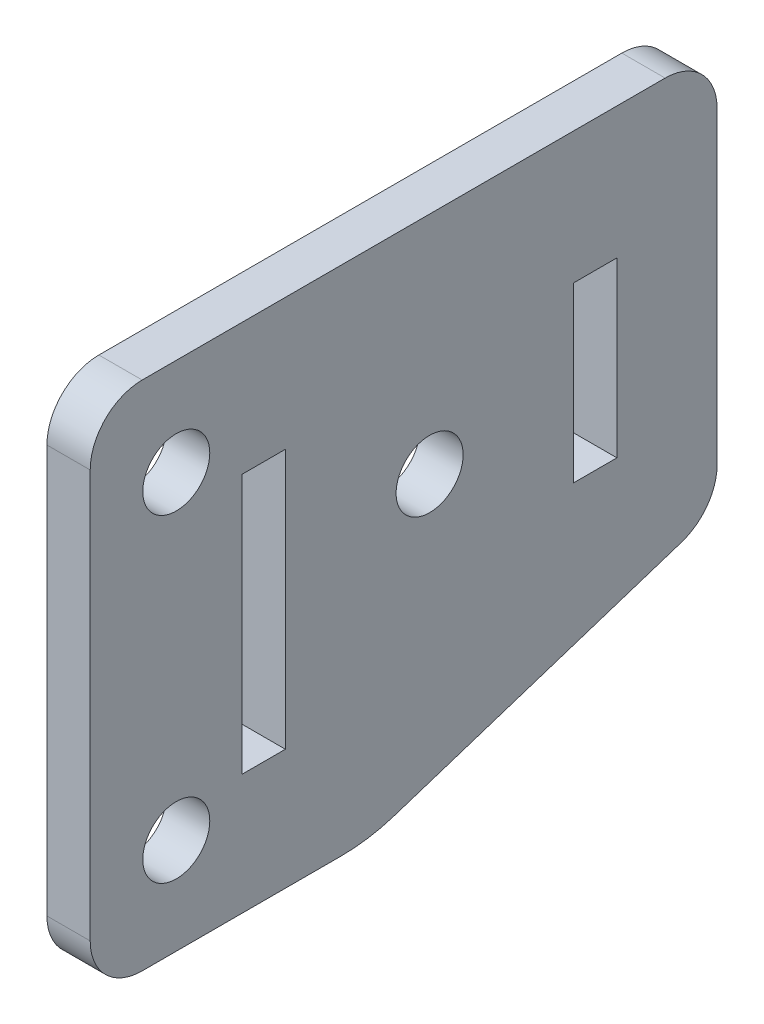
ISO-10303-21;
HEADER;
FILE_DESCRIPTION(('STEP AP214'),'2;1');
FILE_NAME('part.step','',(''),(''),'','','');
FILE_SCHEMA(('AUTOMOTIVE_DESIGN { 1 0 10303 214 1 1 1 1 }'));
ENDSEC;
DATA;
#1=APPLICATION_CONTEXT('core data for automotive mechanical design processes');
#2=APPLICATION_PROTOCOL_DEFINITION('international standard','automotive_design',2000,#1);
#3=PRODUCT_CONTEXT('',#1,'mechanical');
#4=PRODUCT('Part','Part','',(#3));
#5=PRODUCT_RELATED_PRODUCT_CATEGORY('part','',(#4));
#6=PRODUCT_DEFINITION_FORMATION('','',#4);
#7=PRODUCT_DEFINITION_CONTEXT('part definition',#1,'design');
#8=PRODUCT_DEFINITION('design','',#6,#7);
#9=PRODUCT_DEFINITION_SHAPE('','',#8);
#10=(LENGTH_UNIT() NAMED_UNIT(*) SI_UNIT(.MILLI.,.METRE.));
#11=(NAMED_UNIT(*) PLANE_ANGLE_UNIT() SI_UNIT($,.RADIAN.));
#12=(NAMED_UNIT(*) SI_UNIT($,.STERADIAN.) SOLID_ANGLE_UNIT());
#13=UNCERTAINTY_MEASURE_WITH_UNIT(LENGTH_MEASURE(1.E-05),#10,'distance_accuracy_value','');
#14=(GEOMETRIC_REPRESENTATION_CONTEXT(3) GLOBAL_UNCERTAINTY_ASSIGNED_CONTEXT((#13)) GLOBAL_UNIT_ASSIGNED_CONTEXT((#10,
#11,#12)) REPRESENTATION_CONTEXT('',''));
#15=CARTESIAN_POINT('',(0.,0.,0.));
#16=DIRECTION('',(0.,0.,1.));
#17=DIRECTION('',(1.,0.,0.));
#18=AXIS2_PLACEMENT_3D('',#15,#16,#17);
#19=CARTESIAN_POINT('',(-3.175,25.4,57.404));
#20=DIRECTION('',(0.,0.,1.));
#21=DIRECTION('',(0.,-1.,0.));
#22=AXIS2_PLACEMENT_3D('',#19,#20,#21);
#23=PLANE('',#22);
#24=DIRECTION('',(0.,-1.,0.));
#25=VECTOR('',#24,1.);
#26=CARTESIAN_POINT('',(0.,25.4,57.404));
#27=LINE('',#26,#25);
#28=CARTESIAN_POINT('',(0.,21.59,57.404));
#29=VERTEX_POINT('',#28);
#30=CARTESIAN_POINT('',(0.,-8.32104000000001,57.404));
#31=VERTEX_POINT('',#30);
#32=EDGE_CURVE('E258',#29,#31,#27,.T.);
#33=ORIENTED_EDGE('',*,*,#32,.F.);
#34=DIRECTION('',(1.,0.,0.));
#35=VECTOR('',#34,1.);
#36=CARTESIAN_POINT('',(-3.175,21.59,57.404));
#37=LINE('',#36,#35);
#38=CARTESIAN_POINT('',(-3.175,21.59,57.404));
#39=VERTEX_POINT('',#38);
#40=EDGE_CURVE('E42',#29,#39,#37,.F.);
#41=ORIENTED_EDGE('',*,*,#40,.T.);
#42=DIRECTION('',(0.,-1.,0.));
#43=VECTOR('',#42,1.);
#44=CARTESIAN_POINT('',(-3.175,25.4,57.404));
#45=LINE('',#44,#43);
#46=CARTESIAN_POINT('',(-3.175,-8.32104000000001,57.404));
#47=VERTEX_POINT('',#46);
#48=EDGE_CURVE('E269',#39,#47,#45,.T.);
#49=ORIENTED_EDGE('',*,*,#48,.T.);
#50=DIRECTION('',(1.,0.,0.));
#51=VECTOR('',#50,1.);
#52=CARTESIAN_POINT('',(-3.175,-8.32104000000001,57.404));
#53=LINE('',#52,#51);
#54=EDGE_CURVE('E318',#47,#31,#53,.T.);
#55=ORIENTED_EDGE('',*,*,#54,.T.);
#56=EDGE_LOOP('',(#33,#41,#49,#55));
#57=FACE_BOUND('',#56,.T.);
#58=ADVANCED_FACE('F34',(#57),#23,.T.);
#59=CARTESIAN_POINT('',(-3.175,25.4,11.43));
#60=DIRECTION('',(0.,1.,0.));
#61=DIRECTION('',(0.,0.,1.));
#62=AXIS2_PLACEMENT_3D('',#59,#60,#61);
#63=PLANE('',#62);
#64=DIRECTION('',(0.,0.,1.));
#65=VECTOR('',#64,1.);
#66=CARTESIAN_POINT('',(0.,25.4,11.43));
#67=LINE('',#66,#65);
#68=CARTESIAN_POINT('',(0.,25.4,15.24));
#69=VERTEX_POINT('',#68);
#70=CARTESIAN_POINT('',(0.,25.4,53.594));
#71=VERTEX_POINT('',#70);
#72=EDGE_CURVE('E282',#69,#71,#67,.T.);
#73=ORIENTED_EDGE('',*,*,#72,.F.);
#74=DIRECTION('',(1.,0.,0.));
#75=VECTOR('',#74,1.);
#76=CARTESIAN_POINT('',(-3.175,25.4,15.24));
#77=LINE('',#76,#75);
#78=CARTESIAN_POINT('',(-3.175,25.4,15.24));
#79=VERTEX_POINT('',#78);
#80=EDGE_CURVE('E307',#69,#79,#77,.F.);
#81=ORIENTED_EDGE('',*,*,#80,.T.);
#82=DIRECTION('',(0.,0.,1.));
#83=VECTOR('',#82,1.);
#84=CARTESIAN_POINT('',(-3.175,25.4,11.43));
#85=LINE('',#84,#83);
#86=CARTESIAN_POINT('',(-3.175,25.4,53.594));
#87=VERTEX_POINT('',#86);
#88=EDGE_CURVE('E266',#79,#87,#85,.T.);
#89=ORIENTED_EDGE('',*,*,#88,.T.);
#90=DIRECTION('',(1.,0.,0.));
#91=VECTOR('',#90,1.);
#92=CARTESIAN_POINT('',(-3.175,25.4,53.594));
#93=LINE('',#92,#91);
#94=EDGE_CURVE('E304',#87,#71,#93,.T.);
#95=ORIENTED_EDGE('',*,*,#94,.T.);
#96=EDGE_LOOP('',(#73,#81,#89,#95));
#97=FACE_BOUND('',#96,.T.);
#98=ADVANCED_FACE('F332',(#97),#63,.T.);
#99=CARTESIAN_POINT('',(-3.175,-3.83383616291751,11.43));
#100=DIRECTION('',(0.,0.,-1.));
#101=DIRECTION('',(-1.,0.,0.));
#102=AXIS2_PLACEMENT_3D('',#99,#100,#101);
#103=PLANE('',#102);
#104=DIRECTION('',(0.,1.,0.));
#105=VECTOR('',#104,1.);
#106=CARTESIAN_POINT('',(-3.175,-3.83383616291751,11.43));
#107=LINE('',#106,#105);
#108=CARTESIAN_POINT('',(-3.175,-1.06497014433907,11.43));
#109=VERTEX_POINT('',#108);
#110=CARTESIAN_POINT('',(-3.175,21.59,11.43));
#111=VERTEX_POINT('',#110);
#112=EDGE_CURVE('E263',#109,#111,#107,.T.);
#113=ORIENTED_EDGE('',*,*,#112,.T.);
#114=DIRECTION('',(1.,0.,0.));
#115=VECTOR('',#114,1.);
#116=CARTESIAN_POINT('',(-3.175,21.59,11.43));
#117=LINE('',#116,#115);
#118=CARTESIAN_POINT('',(0.,21.59,11.43));
#119=VERTEX_POINT('',#118);
#120=EDGE_CURVE('E293',#111,#119,#117,.T.);
#121=ORIENTED_EDGE('',*,*,#120,.T.);
#122=DIRECTION('',(0.,1.,0.));
#123=VECTOR('',#122,1.);
#124=CARTESIAN_POINT('',(0.,-3.83383616291751,11.43));
#125=LINE('',#124,#123);
#126=CARTESIAN_POINT('',(0.,-1.06497014433907,11.43));
#127=VERTEX_POINT('',#126);
#128=EDGE_CURVE('E279',#127,#119,#125,.T.);
#129=ORIENTED_EDGE('',*,*,#128,.F.);
#130=DIRECTION('',(1.,0.,0.));
#131=VECTOR('',#130,1.);
#132=CARTESIAN_POINT('',(-3.175,-1.06497014433907,11.43));
#133=LINE('',#132,#131);
#134=EDGE_CURVE('E289',#127,#109,#133,.F.);
#135=ORIENTED_EDGE('',*,*,#134,.T.);
#136=EDGE_LOOP('',(#113,#121,#129,#135));
#137=FACE_BOUND('',#136,.T.);
#138=ADVANCED_FACE('F341',(#137),#103,.T.);
#139=CARTESIAN_POINT('',(-3.175,-11.5104536973722,35.0766243864602));
#140=DIRECTION('',(0.,-0.95113493680096,-0.308775536590309));
#141=DIRECTION('',(0.,0.308775536590309,-0.951134936800961));
#142=AXIS2_PLACEMENT_3D('',#139,#140,#141);
#143=PLANE('',#142);
#144=DIRECTION('',(0.,0.308775536590309,-0.95113493680096));
#145=VECTOR('',#144,1.);
#146=CARTESIAN_POINT('',(-3.175,-11.5104536973722,35.0766243864602));
#147=LINE('',#146,#145);
#148=CARTESIAN_POINT('',(-3.175,-11.5104536973722,35.0766243864602));
#149=VERTEX_POINT('',#148);
#150=CARTESIAN_POINT('',(-3.175,-4.68879425355073,14.0635652055909));
#151=VERTEX_POINT('',#150);
#152=EDGE_CURVE('E261',#149,#151,#147,.T.);
#153=ORIENTED_EDGE('',*,*,#152,.T.);
#154=DIRECTION('',(1.,0.,0.));
#155=VECTOR('',#154,1.);
#156=CARTESIAN_POINT('',(-3.175,-4.68879425355073,14.0635652055909));
#157=LINE('',#156,#155);
#158=CARTESIAN_POINT('',(0.,-4.68879425355073,14.0635652055909));
#159=VERTEX_POINT('',#158);
#160=EDGE_CURVE('E315',#151,#159,#157,.T.);
#161=ORIENTED_EDGE('',*,*,#160,.T.);
#162=DIRECTION('',(0.,0.308775536590309,-0.95113493680096));
#163=VECTOR('',#162,1.);
#164=CARTESIAN_POINT('',(0.,-11.5104536973722,35.0766243864602));
#165=LINE('',#164,#163);
#166=CARTESIAN_POINT('',(0.,-11.5104536973722,35.0766243864602));
#167=VERTEX_POINT('',#166);
#168=EDGE_CURVE('E276',#167,#159,#165,.T.);
#169=ORIENTED_EDGE('',*,*,#168,.F.);
#170=DIRECTION('',(1.,0.,0.));
#171=VECTOR('',#170,1.);
#172=CARTESIAN_POINT('',(-3.175,-11.5104536973722,35.0766243864602));
#173=LINE('',#172,#171);
#174=EDGE_CURVE('E287',#149,#167,#173,.T.);
#175=ORIENTED_EDGE('',*,*,#174,.F.);
#176=EDGE_LOOP('',(#153,#161,#169,#175));
#177=FACE_BOUND('',#176,.T.);
#178=ADVANCED_FACE('F348',(#177),#143,.T.);
#179=CARTESIAN_POINT('',(-3.175,0.56895999999998,38.9980737011571));
#180=DIRECTION('',(1.,0.,0.));
#181=DIRECTION('',(0.,0.,-1.));
#182=AXIS2_PLACEMENT_3D('',#179,#180,#181);
#183=CYLINDRICAL_SURFACE('',#182,12.7);
#184=CARTESIAN_POINT('',(0.,0.56895999999998,38.9980737011571));
#185=DIRECTION('',(1.,0.,0.));
#186=DIRECTION('',(0.,0.,-1.));
#187=AXIS2_PLACEMENT_3D('',#184,#185,#186);
#188=CIRCLE('',#187,12.7);
#189=CARTESIAN_POINT('',(0.,-12.13104,38.9980737011571));
#190=VERTEX_POINT('',#189);
#191=EDGE_CURVE('E273',#190,#167,#188,.T.);
#192=ORIENTED_EDGE('',*,*,#191,.F.);
#193=DIRECTION('',(1.,0.,0.));
#194=VECTOR('',#193,1.);
#195=CARTESIAN_POINT('',(-3.175,-12.13104,38.9980737011571));
#196=LINE('',#195,#194);
#197=CARTESIAN_POINT('',(-3.175,-12.13104,38.9980737011571));
#198=VERTEX_POINT('',#197);
#199=EDGE_CURVE('E271',#198,#190,#196,.T.);
#200=ORIENTED_EDGE('',*,*,#199,.F.);
#201=CARTESIAN_POINT('',(-3.175,0.56895999999998,38.9980737011571));
#202=DIRECTION('',(1.,0.,0.));
#203=DIRECTION('',(0.,0.,-1.));
#204=AXIS2_PLACEMENT_3D('',#201,#202,#203);
#205=CIRCLE('',#204,12.7);
#206=EDGE_CURVE('E257',#198,#149,#205,.T.);
#207=ORIENTED_EDGE('',*,*,#206,.T.);
#208=ORIENTED_EDGE('',*,*,#174,.T.);
#209=EDGE_LOOP('',(#192,#200,#207,#208));
#210=FACE_BOUND('',#209,.T.);
#211=ADVANCED_FACE('F353',(#210),#183,.T.);
#212=CARTESIAN_POINT('',(-3.175,-12.13104,38.9980737011571));
#213=DIRECTION('',(0.,-1.,0.));
#214=DIRECTION('',(0.,0.,-1.));
#215=AXIS2_PLACEMENT_3D('',#212,#213,#214);
#216=PLANE('',#215);
#217=DIRECTION('',(0.,0.,-1.));
#218=VECTOR('',#217,1.);
#219=CARTESIAN_POINT('',(0.,-12.13104,38.9980737011571));
#220=LINE('',#219,#218);
#221=CARTESIAN_POINT('',(0.,-12.13104,53.594));
#222=VERTEX_POINT('',#221);
#223=EDGE_CURVE('E254',#222,#190,#220,.T.);
#224=ORIENTED_EDGE('',*,*,#223,.F.);
#225=DIRECTION('',(1.,0.,0.));
#226=VECTOR('',#225,1.);
#227=CARTESIAN_POINT('',(-3.175,-12.13104,53.594));
#228=LINE('',#227,#226);
#229=CARTESIAN_POINT('',(-3.175,-12.13104,53.594));
#230=VERTEX_POINT('',#229);
#231=EDGE_CURVE('E11',#222,#230,#228,.F.);
#232=ORIENTED_EDGE('',*,*,#231,.T.);
#233=DIRECTION('',(0.,0.,-1.));
#234=VECTOR('',#233,1.);
#235=CARTESIAN_POINT('',(-3.175,-12.13104,39.2034693834696));
#236=LINE('',#235,#234);
#237=EDGE_CURVE('E255',#230,#198,#236,.T.);
#238=ORIENTED_EDGE('',*,*,#237,.T.);
#239=ORIENTED_EDGE('',*,*,#199,.T.);
#240=EDGE_LOOP('',(#224,#232,#238,#239));
#241=FACE_BOUND('',#240,.T.);
#242=ADVANCED_FACE('F358',(#241),#216,.T.);
#243=CARTESIAN_POINT('',(-3.175,0.56895999999998,38.9980737011571));
#244=DIRECTION('',(1.,0.,0.));
#245=DIRECTION('',(0.,0.,-1.));
#246=AXIS2_PLACEMENT_3D('',#243,#244,#245);
#247=PLANE('',#246);
#248=DIRECTION('',(0.,-1.,0.));
#249=VECTOR('',#248,1.);
#250=CARTESIAN_POINT('',(-3.175,-3.30200000000007,43.0911));
#251=LINE('',#250,#249);
#252=CARTESIAN_POINT('',(-3.175,15.7479999999999,43.0911));
#253=VERTEX_POINT('',#252);
#254=CARTESIAN_POINT('',(-3.175,-3.30200000000007,43.0911));
#255=VERTEX_POINT('',#254);
#256=EDGE_CURVE('E195',#253,#255,#251,.T.);
#257=ORIENTED_EDGE('',*,*,#256,.F.);
#258=DIRECTION('',(0.,0.,-1.));
#259=VECTOR('',#258,1.);
#260=CARTESIAN_POINT('',(-3.175,15.7479999999999,43.0911));
#261=LINE('',#260,#259);
#262=CARTESIAN_POINT('',(-3.175,15.7479999999999,46.2661));
#263=VERTEX_POINT('',#262);
#264=EDGE_CURVE('E168',#263,#253,#261,.T.);
#265=ORIENTED_EDGE('',*,*,#264,.F.);
#266=DIRECTION('',(0.,1.,0.));
#267=VECTOR('',#266,1.);
#268=CARTESIAN_POINT('',(-3.175,15.7479999999999,46.2661));
#269=LINE('',#268,#267);
#270=CARTESIAN_POINT('',(-3.175,-3.30200000000007,46.2661));
#271=VERTEX_POINT('',#270);
#272=EDGE_CURVE('E186',#271,#263,#269,.T.);
#273=ORIENTED_EDGE('',*,*,#272,.F.);
#274=DIRECTION('',(0.,0.,1.));
#275=VECTOR('',#274,1.);
#276=CARTESIAN_POINT('',(-3.175,-3.30200000000007,46.2661));
#277=LINE('',#276,#275);
#278=EDGE_CURVE('E189',#255,#271,#277,.T.);
#279=ORIENTED_EDGE('',*,*,#278,.F.);
#280=EDGE_LOOP('',(#257,#265,#273,#279));
#281=FACE_BOUND('',#280,.T.);
#282=DIRECTION('',(0.,0.,-1.));
#283=VECTOR('',#282,1.);
#284=CARTESIAN_POINT('',(-3.175,15.7479999999999,21.9521444970417));
#285=LINE('',#284,#283);
#286=CARTESIAN_POINT('',(-3.175,15.7479999999999,21.9521444970417));
#287=VERTEX_POINT('',#286);
#288=CARTESIAN_POINT('',(-3.175,15.7479999999999,18.7771444970417));
#289=VERTEX_POINT('',#288);
#290=EDGE_CURVE('E222',#287,#289,#285,.T.);
#291=ORIENTED_EDGE('',*,*,#290,.F.);
#292=DIRECTION('',(0.,1.,0.));
#293=VECTOR('',#292,1.);
#294=CARTESIAN_POINT('',(-3.175,3.04799999999992,21.9521444970417));
#295=LINE('',#294,#293);
#296=CARTESIAN_POINT('',(-3.175,3.04799999999992,21.9521444970417));
#297=VERTEX_POINT('',#296);
#298=EDGE_CURVE('E220',#297,#287,#295,.T.);
#299=ORIENTED_EDGE('',*,*,#298,.F.);
#300=DIRECTION('',(0.,0.,1.));
#301=VECTOR('',#300,1.);
#302=CARTESIAN_POINT('',(-3.175,3.04799999999992,18.7771444970417));
#303=LINE('',#302,#301);
#304=CARTESIAN_POINT('',(-3.175,3.04799999999992,18.7771444970417));
#305=VERTEX_POINT('',#304);
#306=EDGE_CURVE('E210',#305,#297,#303,.T.);
#307=ORIENTED_EDGE('',*,*,#306,.F.);
#308=DIRECTION('',(0.,-1.,0.));
#309=VECTOR('',#308,1.);
#310=CARTESIAN_POINT('',(-3.175,15.7479999999999,18.7771444970417));
#311=LINE('',#310,#309);
#312=EDGE_CURVE('E225',#289,#305,#311,.T.);
#313=ORIENTED_EDGE('',*,*,#312,.F.);
#314=EDGE_LOOP('',(#291,#299,#307,#313));
#315=FACE_BOUND('',#314,.T.);
#316=CARTESIAN_POINT('',(-3.175,-5.08000000000002,51.0921));
#317=DIRECTION('',(1.,0.,0.));
#318=DIRECTION('',(0.,0.,-1.));
#319=AXIS2_PLACEMENT_3D('',#316,#317,#318);
#320=CIRCLE('',#319,2.45744999999999);
#321=CARTESIAN_POINT('',(-3.175,-5.08000000000002,48.63465));
#322=VERTEX_POINT('',#321);
#323=EDGE_CURVE('E239',#322,#322,#320,.T.);
#324=ORIENTED_EDGE('',*,*,#323,.T.);
#325=EDGE_LOOP('',(#324));
#326=FACE_BOUND('',#325,.T.);
#327=CARTESIAN_POINT('',(-3.175,18.288,51.0921));
#328=DIRECTION('',(1.,0.,0.));
#329=DIRECTION('',(0.,0.,-1.));
#330=AXIS2_PLACEMENT_3D('',#327,#328,#329);
#331=CIRCLE('',#330,2.45744999999999);
#332=CARTESIAN_POINT('',(-3.175,18.288,48.63465));
#333=VERTEX_POINT('',#332);
#334=EDGE_CURVE('E245',#333,#333,#331,.T.);
#335=ORIENTED_EDGE('',*,*,#334,.T.);
#336=EDGE_LOOP('',(#335));
#337=FACE_BOUND('',#336,.T.);
#338=CARTESIAN_POINT('',(-3.175,8.89,32.5120000000061));
#339=DIRECTION('',(1.,0.,0.));
#340=DIRECTION('',(0.,0.,-1.));
#341=AXIS2_PLACEMENT_3D('',#338,#339,#340);
#342=CIRCLE('',#341,2.45744999999999);
#343=CARTESIAN_POINT('',(-3.175,8.89,30.0545500000061));
#344=VERTEX_POINT('',#343);
#345=EDGE_CURVE('E251',#344,#344,#342,.T.);
#346=ORIENTED_EDGE('',*,*,#345,.T.);
#347=EDGE_LOOP('',(#346));
#348=FACE_BOUND('',#347,.T.);
#349=ORIENTED_EDGE('',*,*,#88,.F.);
#350=CARTESIAN_POINT('',(-3.175,21.59,15.24));
#351=DIRECTION('',(1.,0.,0.));
#352=DIRECTION('',(0.,0.,-1.));
#353=AXIS2_PLACEMENT_3D('',#350,#351,#352);
#354=CIRCLE('',#353,3.81);
#355=EDGE_CURVE('E313',#79,#111,#354,.F.);
#356=ORIENTED_EDGE('',*,*,#355,.T.);
#357=ORIENTED_EDGE('',*,*,#112,.F.);
#358=CARTESIAN_POINT('',(-3.175,-1.06497014433907,15.24));
#359=DIRECTION('',(1.,0.,0.));
#360=DIRECTION('',(0.,0.,-1.));
#361=AXIS2_PLACEMENT_3D('',#358,#359,#360);
#362=CIRCLE('',#361,3.81);
#363=EDGE_CURVE('E49',#109,#151,#362,.F.);
#364=ORIENTED_EDGE('',*,*,#363,.T.);
#365=ORIENTED_EDGE('',*,*,#152,.F.);
#366=ORIENTED_EDGE('',*,*,#206,.F.);
#367=ORIENTED_EDGE('',*,*,#237,.F.);
#368=CARTESIAN_POINT('',(-3.175,-8.32104000000001,53.594));
#369=DIRECTION('',(1.,0.,0.));
#370=DIRECTION('',(0.,0.,-1.));
#371=AXIS2_PLACEMENT_3D('',#368,#369,#370);
#372=CIRCLE('',#371,3.81);
#373=EDGE_CURVE('E56',#230,#47,#372,.F.);
#374=ORIENTED_EDGE('',*,*,#373,.T.);
#375=ORIENTED_EDGE('',*,*,#48,.F.);
#376=CARTESIAN_POINT('',(-3.175,21.59,53.594));
#377=DIRECTION('',(1.,0.,0.));
#378=DIRECTION('',(0.,0.,-1.));
#379=AXIS2_PLACEMENT_3D('',#376,#377,#378);
#380=CIRCLE('',#379,3.81);
#381=EDGE_CURVE('E310',#39,#87,#380,.F.);
#382=ORIENTED_EDGE('',*,*,#381,.T.);
#383=EDGE_LOOP('',(#349,#356,#357,#364,#365,#366,#367,#374,#375,#382));
#384=FACE_BOUND('',#383,.T.);
#385=ADVANCED_FACE('F327',(#281,#315,#326,#337,#348,#384),#247,.F.);
#386=CARTESIAN_POINT('',(0.,0.56895999999998,38.9980737011571));
#387=DIRECTION('',(1.,0.,0.));
#388=DIRECTION('',(0.,0.,-1.));
#389=AXIS2_PLACEMENT_3D('',#386,#387,#388);
#390=PLANE('',#389);
#391=DIRECTION('',(0.,0.,-1.));
#392=VECTOR('',#391,1.);
#393=CARTESIAN_POINT('',(0.,15.7479999999999,43.0911));
#394=LINE('',#393,#392);
#395=CARTESIAN_POINT('',(0.,15.7479999999999,46.2661));
#396=VERTEX_POINT('',#395);
#397=CARTESIAN_POINT('',(0.,15.7479999999999,43.0911));
#398=VERTEX_POINT('',#397);
#399=EDGE_CURVE('E165',#396,#398,#394,.T.);
#400=ORIENTED_EDGE('',*,*,#399,.T.);
#401=DIRECTION('',(0.,-1.,0.));
#402=VECTOR('',#401,1.);
#403=CARTESIAN_POINT('',(0.,-3.30200000000007,43.0911));
#404=LINE('',#403,#402);
#405=CARTESIAN_POINT('',(0.,-3.30200000000007,43.0911));
#406=VERTEX_POINT('',#405);
#407=EDGE_CURVE('E177',#398,#406,#404,.T.);
#408=ORIENTED_EDGE('',*,*,#407,.T.);
#409=DIRECTION('',(0.,0.,1.));
#410=VECTOR('',#409,1.);
#411=CARTESIAN_POINT('',(0.,-3.30200000000007,46.2661));
#412=LINE('',#411,#410);
#413=CARTESIAN_POINT('',(0.,-3.30200000000007,46.2661));
#414=VERTEX_POINT('',#413);
#415=EDGE_CURVE('E181',#406,#414,#412,.T.);
#416=ORIENTED_EDGE('',*,*,#415,.T.);
#417=DIRECTION('',(0.,1.,0.));
#418=VECTOR('',#417,1.);
#419=CARTESIAN_POINT('',(0.,15.7479999999999,46.2661));
#420=LINE('',#419,#418);
#421=EDGE_CURVE('E173',#414,#396,#420,.T.);
#422=ORIENTED_EDGE('',*,*,#421,.T.);
#423=EDGE_LOOP('',(#400,#408,#416,#422));
#424=FACE_BOUND('',#423,.T.);
#425=DIRECTION('',(0.,1.,0.));
#426=VECTOR('',#425,1.);
#427=CARTESIAN_POINT('',(0.,3.04799999999992,21.9521444970417));
#428=LINE('',#427,#426);
#429=CARTESIAN_POINT('',(0.,3.04799999999992,21.9521444970417));
#430=VERTEX_POINT('',#429);
#431=CARTESIAN_POINT('',(0.,15.7479999999999,21.9521444970417));
#432=VERTEX_POINT('',#431);
#433=EDGE_CURVE('E206',#430,#432,#428,.T.);
#434=ORIENTED_EDGE('',*,*,#433,.T.);
#435=DIRECTION('',(0.,0.,-1.));
#436=VECTOR('',#435,1.);
#437=CARTESIAN_POINT('',(0.,15.7479999999999,21.9521444970417));
#438=LINE('',#437,#436);
#439=CARTESIAN_POINT('',(0.,15.7479999999999,18.7771444970417));
#440=VERTEX_POINT('',#439);
#441=EDGE_CURVE('E209',#432,#440,#438,.T.);
#442=ORIENTED_EDGE('',*,*,#441,.T.);
#443=DIRECTION('',(0.,-1.,0.));
#444=VECTOR('',#443,1.);
#445=CARTESIAN_POINT('',(0.,15.7479999999999,18.7771444970417));
#446=LINE('',#445,#444);
#447=CARTESIAN_POINT('',(0.,3.04799999999992,18.7771444970417));
#448=VERTEX_POINT('',#447);
#449=EDGE_CURVE('E213',#440,#448,#446,.T.);
#450=ORIENTED_EDGE('',*,*,#449,.T.);
#451=DIRECTION('',(0.,0.,1.));
#452=VECTOR('',#451,1.);
#453=CARTESIAN_POINT('',(0.,3.04799999999992,18.7771444970417));
#454=LINE('',#453,#452);
#455=EDGE_CURVE('E216',#448,#430,#454,.T.);
#456=ORIENTED_EDGE('',*,*,#455,.T.);
#457=EDGE_LOOP('',(#434,#442,#450,#456));
#458=FACE_BOUND('',#457,.T.);
#459=CARTESIAN_POINT('',(0.,-5.08000000000002,51.0921));
#460=DIRECTION('',(1.,0.,0.));
#461=DIRECTION('',(0.,0.,-1.));
#462=AXIS2_PLACEMENT_3D('',#459,#460,#461);
#463=CIRCLE('',#462,2.45744999999999);
#464=CARTESIAN_POINT('',(0.,-5.08000000000002,48.63465));
#465=VERTEX_POINT('',#464);
#466=EDGE_CURVE('E202',#465,#465,#463,.T.);
#467=ORIENTED_EDGE('',*,*,#466,.F.);
#468=EDGE_LOOP('',(#467));
#469=FACE_BOUND('',#468,.T.);
#470=CARTESIAN_POINT('',(0.,18.288,51.0921));
#471=DIRECTION('',(1.,0.,0.));
#472=DIRECTION('',(0.,0.,-1.));
#473=AXIS2_PLACEMENT_3D('',#470,#471,#472);
#474=CIRCLE('',#473,2.45744999999999);
#475=CARTESIAN_POINT('',(0.,18.288,48.63465));
#476=VERTEX_POINT('',#475);
#477=EDGE_CURVE('E242',#476,#476,#474,.T.);
#478=ORIENTED_EDGE('',*,*,#477,.F.);
#479=EDGE_LOOP('',(#478));
#480=FACE_BOUND('',#479,.T.);
#481=CARTESIAN_POINT('',(0.,8.89,32.5120000000061));
#482=DIRECTION('',(1.,0.,0.));
#483=DIRECTION('',(0.,0.,-1.));
#484=AXIS2_PLACEMENT_3D('',#481,#482,#483);
#485=CIRCLE('',#484,2.45744999999999);
#486=CARTESIAN_POINT('',(0.,8.89,30.0545500000061));
#487=VERTEX_POINT('',#486);
#488=EDGE_CURVE('E248',#487,#487,#485,.T.);
#489=ORIENTED_EDGE('',*,*,#488,.F.);
#490=EDGE_LOOP('',(#489));
#491=FACE_BOUND('',#490,.T.);
#492=ORIENTED_EDGE('',*,*,#128,.T.);
#493=CARTESIAN_POINT('',(0.,21.59,15.24));
#494=DIRECTION('',(1.,0.,0.));
#495=DIRECTION('',(0.,0.,-1.));
#496=AXIS2_PLACEMENT_3D('',#493,#494,#495);
#497=CIRCLE('',#496,3.81);
#498=EDGE_CURVE('E302',#119,#69,#497,.T.);
#499=ORIENTED_EDGE('',*,*,#498,.T.);
#500=ORIENTED_EDGE('',*,*,#72,.T.);
#501=CARTESIAN_POINT('',(0.,21.59,53.594));
#502=DIRECTION('',(1.,0.,0.));
#503=DIRECTION('',(0.,0.,-1.));
#504=AXIS2_PLACEMENT_3D('',#501,#502,#503);
#505=CIRCLE('',#504,3.81);
#506=EDGE_CURVE('E298',#71,#29,#505,.T.);
#507=ORIENTED_EDGE('',*,*,#506,.T.);
#508=ORIENTED_EDGE('',*,*,#32,.T.);
#509=CARTESIAN_POINT('',(0.,-8.32104000000001,53.594));
#510=DIRECTION('',(1.,0.,0.));
#511=DIRECTION('',(0.,0.,-1.));
#512=AXIS2_PLACEMENT_3D('',#509,#510,#511);
#513=CIRCLE('',#512,3.81);
#514=EDGE_CURVE('E296',#31,#222,#513,.T.);
#515=ORIENTED_EDGE('',*,*,#514,.T.);
#516=ORIENTED_EDGE('',*,*,#223,.T.);
#517=ORIENTED_EDGE('',*,*,#191,.T.);
#518=ORIENTED_EDGE('',*,*,#168,.T.);
#519=CARTESIAN_POINT('',(0.,-1.06497014433907,15.24));
#520=DIRECTION('',(1.,0.,0.));
#521=DIRECTION('',(0.,0.,-1.));
#522=AXIS2_PLACEMENT_3D('',#519,#520,#521);
#523=CIRCLE('',#522,3.81);
#524=EDGE_CURVE('E300',#159,#127,#523,.T.);
#525=ORIENTED_EDGE('',*,*,#524,.T.);
#526=EDGE_LOOP('',(#492,#499,#500,#507,#508,#515,#516,#517,#518,#525));
#527=FACE_BOUND('',#526,.T.);
#528=ADVANCED_FACE('F183',(#424,#458,#469,#480,#491,#527),#390,.T.);
#529=CARTESIAN_POINT('',(0.,8.89,32.5120000000061));
#530=DIRECTION('',(1.,0.,0.));
#531=DIRECTION('',(0.,0.,-1.));
#532=AXIS2_PLACEMENT_3D('',#529,#530,#531);
#533=CYLINDRICAL_SURFACE('',#532,2.45744999999999);
#534=ORIENTED_EDGE('',*,*,#488,.T.);
#535=EDGE_LOOP('',(#534));
#536=FACE_BOUND('',#535,.T.);
#537=ORIENTED_EDGE('',*,*,#345,.F.);
#538=EDGE_LOOP('',(#537));
#539=FACE_BOUND('',#538,.T.);
#540=ADVANCED_FACE('F394',(#536,#539),#533,.F.);
#541=CARTESIAN_POINT('',(0.,18.288,51.0921));
#542=DIRECTION('',(1.,0.,0.));
#543=DIRECTION('',(0.,0.,-1.));
#544=AXIS2_PLACEMENT_3D('',#541,#542,#543);
#545=CYLINDRICAL_SURFACE('',#544,2.45744999999999);
#546=ORIENTED_EDGE('',*,*,#477,.T.);
#547=EDGE_LOOP('',(#546));
#548=FACE_BOUND('',#547,.T.);
#549=ORIENTED_EDGE('',*,*,#334,.F.);
#550=EDGE_LOOP('',(#549));
#551=FACE_BOUND('',#550,.T.);
#552=ADVANCED_FACE('F399',(#548,#551),#545,.F.);
#553=CARTESIAN_POINT('',(0.,-5.08000000000002,51.0921));
#554=DIRECTION('',(1.,0.,0.));
#555=DIRECTION('',(0.,0.,-1.));
#556=AXIS2_PLACEMENT_3D('',#553,#554,#555);
#557=CYLINDRICAL_SURFACE('',#556,2.45744999999999);
#558=ORIENTED_EDGE('',*,*,#466,.T.);
#559=EDGE_LOOP('',(#558));
#560=FACE_BOUND('',#559,.T.);
#561=ORIENTED_EDGE('',*,*,#323,.F.);
#562=EDGE_LOOP('',(#561));
#563=FACE_BOUND('',#562,.T.);
#564=ADVANCED_FACE('F411',(#560,#563),#557,.F.);
#565=CARTESIAN_POINT('',(0.,3.04799999999992,21.9521444970417));
#566=DIRECTION('',(0.,0.,1.));
#567=DIRECTION('',(1.,0.,0.));
#568=AXIS2_PLACEMENT_3D('',#565,#566,#567);
#569=PLANE('',#568);
#570=ORIENTED_EDGE('',*,*,#298,.T.);
#571=DIRECTION('',(-1.,0.,0.));
#572=VECTOR('',#571,1.);
#573=CARTESIAN_POINT('',(0.,15.7479999999999,21.9521444970417));
#574=LINE('',#573,#572);
#575=EDGE_CURVE('E219',#432,#287,#574,.T.);
#576=ORIENTED_EDGE('',*,*,#575,.F.);
#577=ORIENTED_EDGE('',*,*,#433,.F.);
#578=DIRECTION('',(-1.,0.,0.));
#579=VECTOR('',#578,1.);
#580=CARTESIAN_POINT('',(0.,3.04799999999992,21.9521444970417));
#581=LINE('',#580,#579);
#582=EDGE_CURVE('E196',#430,#297,#581,.T.);
#583=ORIENTED_EDGE('',*,*,#582,.T.);
#584=EDGE_LOOP('',(#570,#576,#577,#583));
#585=FACE_BOUND('',#584,.T.);
#586=ADVANCED_FACE('F421',(#585),#569,.F.);
#587=CARTESIAN_POINT('',(0.,3.04799999999992,18.7771444970417));
#588=DIRECTION('',(0.,-1.,0.));
#589=DIRECTION('',(0.,0.,-1.));
#590=AXIS2_PLACEMENT_3D('',#587,#588,#589);
#591=PLANE('',#590);
#592=ORIENTED_EDGE('',*,*,#306,.T.);
#593=ORIENTED_EDGE('',*,*,#582,.F.);
#594=ORIENTED_EDGE('',*,*,#455,.F.);
#595=DIRECTION('',(-1.,0.,0.));
#596=VECTOR('',#595,1.);
#597=CARTESIAN_POINT('',(0.,3.04799999999992,18.7771444970417));
#598=LINE('',#597,#596);
#599=EDGE_CURVE('E231',#448,#305,#598,.T.);
#600=ORIENTED_EDGE('',*,*,#599,.T.);
#601=EDGE_LOOP('',(#592,#593,#594,#600));
#602=FACE_BOUND('',#601,.T.);
#603=ADVANCED_FACE('F431',(#602),#591,.F.);
#604=CARTESIAN_POINT('',(0.,15.7479999999999,18.7771444970417));
#605=DIRECTION('',(0.,0.,-1.));
#606=DIRECTION('',(-1.,0.,0.));
#607=AXIS2_PLACEMENT_3D('',#604,#605,#606);
#608=PLANE('',#607);
#609=ORIENTED_EDGE('',*,*,#312,.T.);
#610=ORIENTED_EDGE('',*,*,#599,.F.);
#611=ORIENTED_EDGE('',*,*,#449,.F.);
#612=DIRECTION('',(-1.,0.,0.));
#613=VECTOR('',#612,1.);
#614=CARTESIAN_POINT('',(0.,15.7479999999999,18.7771444970417));
#615=LINE('',#614,#613);
#616=EDGE_CURVE('E233',#440,#289,#615,.T.);
#617=ORIENTED_EDGE('',*,*,#616,.T.);
#618=EDGE_LOOP('',(#609,#610,#611,#617));
#619=FACE_BOUND('',#618,.T.);
#620=ADVANCED_FACE('F441',(#619),#608,.F.);
#621=CARTESIAN_POINT('',(0.,15.7479999999999,21.9521444970417));
#622=DIRECTION('',(0.,1.,0.));
#623=DIRECTION('',(0.,0.,1.));
#624=AXIS2_PLACEMENT_3D('',#621,#622,#623);
#625=PLANE('',#624);
#626=ORIENTED_EDGE('',*,*,#290,.T.);
#627=ORIENTED_EDGE('',*,*,#616,.F.);
#628=ORIENTED_EDGE('',*,*,#441,.F.);
#629=ORIENTED_EDGE('',*,*,#575,.T.);
#630=EDGE_LOOP('',(#626,#627,#628,#629));
#631=FACE_BOUND('',#630,.T.);
#632=ADVANCED_FACE('F451',(#631),#625,.F.);
#633=CARTESIAN_POINT('',(0.,15.7479999999999,43.0911));
#634=DIRECTION('',(0.,1.,0.));
#635=DIRECTION('',(0.,0.,1.));
#636=AXIS2_PLACEMENT_3D('',#633,#634,#635);
#637=PLANE('',#636);
#638=ORIENTED_EDGE('',*,*,#264,.T.);
#639=DIRECTION('',(-1.,0.,0.));
#640=VECTOR('',#639,1.);
#641=CARTESIAN_POINT('',(0.,15.7479999999999,43.0911));
#642=LINE('',#641,#640);
#643=EDGE_CURVE('E161',#398,#253,#642,.T.);
#644=ORIENTED_EDGE('',*,*,#643,.F.);
#645=ORIENTED_EDGE('',*,*,#399,.F.);
#646=DIRECTION('',(-1.,0.,0.));
#647=VECTOR('',#646,1.);
#648=CARTESIAN_POINT('',(0.,15.7479999999999,46.2661));
#649=LINE('',#648,#647);
#650=EDGE_CURVE('E200',#396,#263,#649,.T.);
#651=ORIENTED_EDGE('',*,*,#650,.T.);
#652=EDGE_LOOP('',(#638,#644,#645,#651));
#653=FACE_BOUND('',#652,.T.);
#654=ADVANCED_FACE('F163',(#653),#637,.F.);
#655=CARTESIAN_POINT('',(0.,15.7479999999999,46.2661));
#656=DIRECTION('',(0.,0.,1.));
#657=DIRECTION('',(0.,-1.,0.));
#658=AXIS2_PLACEMENT_3D('',#655,#656,#657);
#659=PLANE('',#658);
#660=ORIENTED_EDGE('',*,*,#272,.T.);
#661=ORIENTED_EDGE('',*,*,#650,.F.);
#662=ORIENTED_EDGE('',*,*,#421,.F.);
#663=DIRECTION('',(-1.,0.,0.));
#664=VECTOR('',#663,1.);
#665=CARTESIAN_POINT('',(0.,-3.30200000000007,46.2661));
#666=LINE('',#665,#664);
#667=EDGE_CURVE('E203',#414,#271,#666,.T.);
#668=ORIENTED_EDGE('',*,*,#667,.T.);
#669=EDGE_LOOP('',(#660,#661,#662,#668));
#670=FACE_BOUND('',#669,.T.);
#671=ADVANCED_FACE('F470',(#670),#659,.F.);
#672=CARTESIAN_POINT('',(0.,-3.30200000000007,46.2661));
#673=DIRECTION('',(0.,-1.,0.));
#674=DIRECTION('',(0.,0.,-1.));
#675=AXIS2_PLACEMENT_3D('',#672,#673,#674);
#676=PLANE('',#675);
#677=ORIENTED_EDGE('',*,*,#278,.T.);
#678=ORIENTED_EDGE('',*,*,#667,.F.);
#679=ORIENTED_EDGE('',*,*,#415,.F.);
#680=DIRECTION('',(-1.,0.,0.));
#681=VECTOR('',#680,1.);
#682=CARTESIAN_POINT('',(0.,-3.30200000000007,43.0911));
#683=LINE('',#682,#681);
#684=EDGE_CURVE('E172',#406,#255,#683,.T.);
#685=ORIENTED_EDGE('',*,*,#684,.T.);
#686=EDGE_LOOP('',(#677,#678,#679,#685));
#687=FACE_BOUND('',#686,.T.);
#688=ADVANCED_FACE('F479',(#687),#676,.F.);
#689=CARTESIAN_POINT('',(0.,-3.30200000000007,43.0911));
#690=DIRECTION('',(0.,0.,-1.));
#691=DIRECTION('',(-1.,0.,0.));
#692=AXIS2_PLACEMENT_3D('',#689,#690,#691);
#693=PLANE('',#692);
#694=ORIENTED_EDGE('',*,*,#256,.T.);
#695=ORIENTED_EDGE('',*,*,#684,.F.);
#696=ORIENTED_EDGE('',*,*,#407,.F.);
#697=ORIENTED_EDGE('',*,*,#643,.T.);
#698=EDGE_LOOP('',(#694,#695,#696,#697));
#699=FACE_BOUND('',#698,.T.);
#700=ADVANCED_FACE('F178',(#699),#693,.F.);
#701=CARTESIAN_POINT('',(-3.175,21.59,15.24));
#702=DIRECTION('',(1.,0.,0.));
#703=DIRECTION('',(0.,0.,-1.));
#704=AXIS2_PLACEMENT_3D('',#701,#702,#703);
#705=CYLINDRICAL_SURFACE('',#704,3.81);
#706=ORIENTED_EDGE('',*,*,#355,.F.);
#707=ORIENTED_EDGE('',*,*,#80,.F.);
#708=ORIENTED_EDGE('',*,*,#498,.F.);
#709=ORIENTED_EDGE('',*,*,#120,.F.);
#710=EDGE_LOOP('',(#706,#707,#708,#709));
#711=FACE_BOUND('',#710,.T.);
#712=ADVANCED_FACE('F339',(#711),#705,.T.);
#713=CARTESIAN_POINT('',(-3.175,-1.06497014433907,15.24));
#714=DIRECTION('',(1.,0.,0.));
#715=DIRECTION('',(0.,0.,-1.));
#716=AXIS2_PLACEMENT_3D('',#713,#714,#715);
#717=CYLINDRICAL_SURFACE('',#716,3.81);
#718=ORIENTED_EDGE('',*,*,#363,.F.);
#719=ORIENTED_EDGE('',*,*,#134,.F.);
#720=ORIENTED_EDGE('',*,*,#524,.F.);
#721=ORIENTED_EDGE('',*,*,#160,.F.);
#722=EDGE_LOOP('',(#718,#719,#720,#721));
#723=FACE_BOUND('',#722,.T.);
#724=ADVANCED_FACE('F345',(#723),#717,.T.);
#725=CARTESIAN_POINT('',(-3.175,21.59,53.594));
#726=DIRECTION('',(1.,0.,0.));
#727=DIRECTION('',(0.,0.,-1.));
#728=AXIS2_PLACEMENT_3D('',#725,#726,#727);
#729=CYLINDRICAL_SURFACE('',#728,3.81);
#730=ORIENTED_EDGE('',*,*,#381,.F.);
#731=ORIENTED_EDGE('',*,*,#40,.F.);
#732=ORIENTED_EDGE('',*,*,#506,.F.);
#733=ORIENTED_EDGE('',*,*,#94,.F.);
#734=EDGE_LOOP('',(#730,#731,#732,#733));
#735=FACE_BOUND('',#734,.T.);
#736=ADVANCED_FACE('F329',(#735),#729,.T.);
#737=CARTESIAN_POINT('',(-3.175,-8.32104000000001,53.594));
#738=DIRECTION('',(1.,0.,0.));
#739=DIRECTION('',(0.,0.,-1.));
#740=AXIS2_PLACEMENT_3D('',#737,#738,#739);
#741=CYLINDRICAL_SURFACE('',#740,3.81);
#742=ORIENTED_EDGE('',*,*,#373,.F.);
#743=ORIENTED_EDGE('',*,*,#231,.F.);
#744=ORIENTED_EDGE('',*,*,#514,.F.);
#745=ORIENTED_EDGE('',*,*,#54,.F.);
#746=EDGE_LOOP('',(#742,#743,#744,#745));
#747=FACE_BOUND('',#746,.T.);
#748=ADVANCED_FACE('F36',(#747),#741,.T.);
#749=CLOSED_SHELL('',(#58,#98,#138,#178,#211,#242,#385,#528,#540,#552,#564,#586,#603,#620,#632,
#654,#671,#688,#700,#712,#724,#736,#748));
#750=MANIFOLD_SOLID_BREP('B2',#749);
#751=ADVANCED_BREP_SHAPE_REPRESENTATION('',(#18,#750),#14);
#752=SHAPE_DEFINITION_REPRESENTATION(#9,#751);
ENDSEC;
END-ISO-10303-21;
